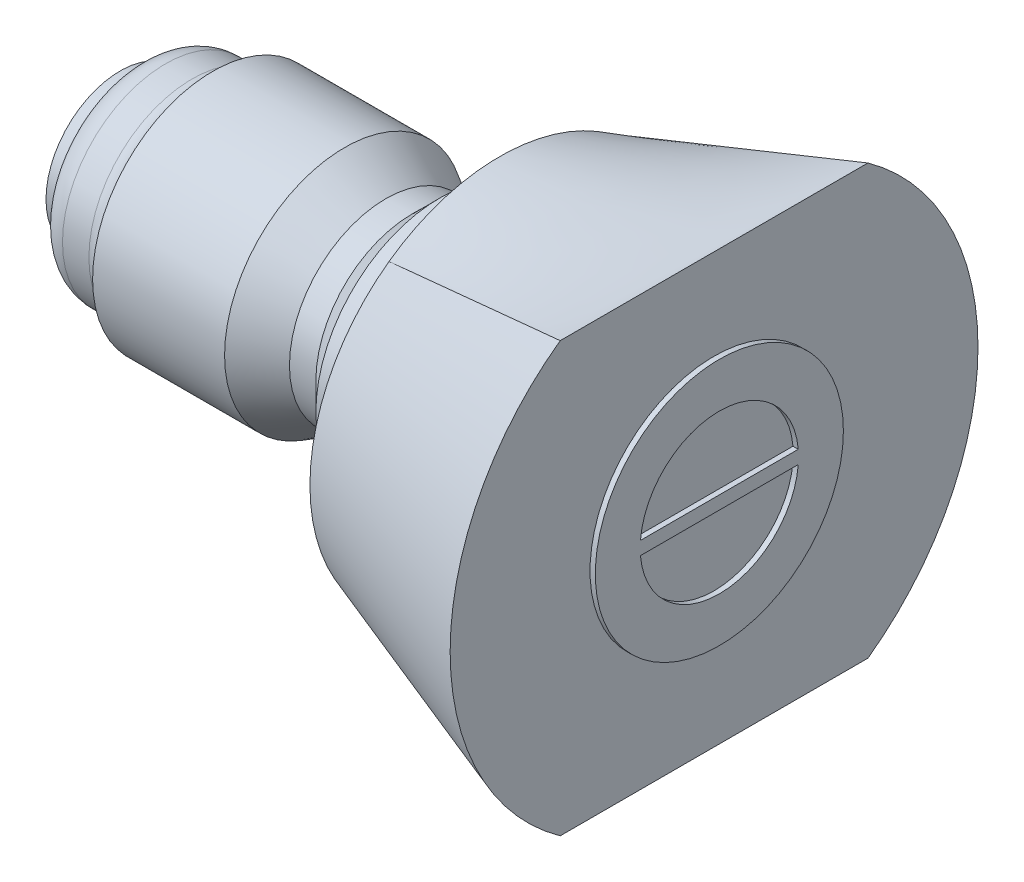
ISO-10303-21;
HEADER;
FILE_DESCRIPTION(('STEP AP214'),'2;1');
FILE_NAME('part.step','',(''),(''),'','','');
FILE_SCHEMA(('AUTOMOTIVE_DESIGN { 1 0 10303 214 1 1 1 1 }'));
ENDSEC;
DATA;
#1=APPLICATION_CONTEXT('core data for automotive mechanical design processes');
#2=APPLICATION_PROTOCOL_DEFINITION('international standard','automotive_design',2000,#1);
#3=PRODUCT_CONTEXT('',#1,'mechanical');
#4=PRODUCT('Part','Part','',(#3));
#5=PRODUCT_RELATED_PRODUCT_CATEGORY('part','',(#4));
#6=PRODUCT_DEFINITION_FORMATION('','',#4);
#7=PRODUCT_DEFINITION_CONTEXT('part definition',#1,'design');
#8=PRODUCT_DEFINITION('design','',#6,#7);
#9=PRODUCT_DEFINITION_SHAPE('','',#8);
#10=(LENGTH_UNIT() NAMED_UNIT(*) SI_UNIT(.MILLI.,.METRE.));
#11=(NAMED_UNIT(*) PLANE_ANGLE_UNIT() SI_UNIT($,.RADIAN.));
#12=(NAMED_UNIT(*) SI_UNIT($,.STERADIAN.) SOLID_ANGLE_UNIT());
#13=UNCERTAINTY_MEASURE_WITH_UNIT(LENGTH_MEASURE(1.E-05),#10,'distance_accuracy_value','');
#14=(GEOMETRIC_REPRESENTATION_CONTEXT(3) GLOBAL_UNCERTAINTY_ASSIGNED_CONTEXT((#13)) GLOBAL_UNIT_ASSIGNED_CONTEXT((#10,
#11,#12)) REPRESENTATION_CONTEXT('',''));
#15=CARTESIAN_POINT('',(0.,0.,0.));
#16=DIRECTION('',(0.,0.,1.));
#17=DIRECTION('',(1.,0.,0.));
#18=AXIS2_PLACEMENT_3D('',#15,#16,#17);
#19=CARTESIAN_POINT('',(0.,0.,0.));
#20=DIRECTION('',(-1.,0.,0.));
#21=DIRECTION('',(0.,0.,1.));
#22=AXIS2_PLACEMENT_3D('',#19,#20,#21);
#23=CYLINDRICAL_SURFACE('',#22,3.175);
#24=CARTESIAN_POINT('',(0.,0.,0.));
#25=DIRECTION('',(-1.,0.,0.));
#26=DIRECTION('',(0.,0.,1.));
#27=AXIS2_PLACEMENT_3D('',#24,#25,#26);
#28=CIRCLE('',#27,3.175);
#29=CARTESIAN_POINT('',(0.,0.,3.175));
#30=VERTEX_POINT('',#29);
#31=EDGE_CURVE('E287',#30,#30,#28,.T.);
#32=ORIENTED_EDGE('',*,*,#31,.T.);
#33=EDGE_LOOP('',(#32));
#34=FACE_BOUND('',#33,.T.);
#35=CARTESIAN_POINT('',(18.25625,0.,0.));
#36=DIRECTION('',(1.,0.,0.));
#37=DIRECTION('',(0.,0.,-1.));
#38=AXIS2_PLACEMENT_3D('',#35,#36,#37);
#39=CIRCLE('',#38,3.175);
#40=CARTESIAN_POINT('',(18.25625,0.,-3.175));
#41=VERTEX_POINT('',#40);
#42=EDGE_CURVE('E82',#41,#41,#39,.F.);
#43=ORIENTED_EDGE('',*,*,#42,.F.);
#44=EDGE_LOOP('',(#43));
#45=FACE_BOUND('',#44,.T.);
#46=ADVANCED_FACE('F71',(#34,#45),#23,.F.);
#47=CARTESIAN_POINT('',(0.,0.,0.));
#48=DIRECTION('',(-1.,0.,0.));
#49=DIRECTION('',(0.,0.,1.));
#50=AXIS2_PLACEMENT_3D('',#47,#48,#49);
#51=CYLINDRICAL_SURFACE('',#50,5.953125);
#52=CARTESIAN_POINT('',(15.3666044903084,0.,0.));
#53=DIRECTION('',(-1.,0.,0.));
#54=DIRECTION('',(0.,0.,1.));
#55=AXIS2_PLACEMENT_3D('',#52,#53,#54);
#56=CIRCLE('',#55,5.953125);
#57=CARTESIAN_POINT('',(15.3666044903084,0.,5.953125));
#58=VERTEX_POINT('',#57);
#59=EDGE_CURVE('E284',#58,#58,#56,.T.);
#60=ORIENTED_EDGE('',*,*,#59,.F.);
#61=EDGE_LOOP('',(#60));
#62=FACE_BOUND('',#61,.T.);
#63=CARTESIAN_POINT('',(18.25625,0.,0.));
#64=DIRECTION('',(1.,0.,0.));
#65=DIRECTION('',(0.,0.,-1.));
#66=AXIS2_PLACEMENT_3D('',#63,#64,#65);
#67=CIRCLE('',#66,5.953125);
#68=CARTESIAN_POINT('',(18.25625,0.,-5.953125));
#69=VERTEX_POINT('',#68);
#70=EDGE_CURVE('E259',#69,#69,#67,.T.);
#71=ORIENTED_EDGE('',*,*,#70,.F.);
#72=EDGE_LOOP('',(#71));
#73=FACE_BOUND('',#72,.T.);
#74=ADVANCED_FACE('F309',(#62,#73),#51,.T.);
#75=CARTESIAN_POINT('',(0.,0.,-3.571875));
#76=DIRECTION('',(1.,0.,0.));
#77=DIRECTION('',(0.,0.,-1.));
#78=AXIS2_PLACEMENT_3D('',#75,#76,#77);
#79=PLANE('',#78);
#80=ORIENTED_EDGE('',*,*,#31,.F.);
#81=EDGE_LOOP('',(#80));
#82=FACE_BOUND('',#81,.T.);
#83=CARTESIAN_POINT('',(0.,0.,0.));
#84=DIRECTION('',(-1.,0.,0.));
#85=DIRECTION('',(0.,0.,1.));
#86=AXIS2_PLACEMENT_3D('',#83,#84,#85);
#87=CIRCLE('',#86,3.571875);
#88=CARTESIAN_POINT('',(0.,0.,3.571875));
#89=VERTEX_POINT('',#88);
#90=EDGE_CURVE('E260',#89,#89,#87,.T.);
#91=ORIENTED_EDGE('',*,*,#90,.T.);
#92=EDGE_LOOP('',(#91));
#93=FACE_BOUND('',#92,.T.);
#94=ADVANCED_FACE('F73',(#82,#93),#79,.F.);
#95=CARTESIAN_POINT('',(15.3666044903084,0.,0.));
#96=DIRECTION('',(1.,0.,0.));
#97=DIRECTION('',(0.,0.,-1.));
#98=AXIS2_PLACEMENT_3D('',#95,#96,#97);
#99=CONICAL_SURFACE('',#98,5.953125,0.78539816339745);
#100=CARTESIAN_POINT('',(14.0489794903084,0.,0.));
#101=DIRECTION('',(-1.,0.,0.));
#102=DIRECTION('',(0.,0.,1.));
#103=AXIS2_PLACEMENT_3D('',#100,#101,#102);
#104=CIRCLE('',#103,4.6355);
#105=CARTESIAN_POINT('',(14.0489794903084,0.,4.6355));
#106=VERTEX_POINT('',#105);
#107=EDGE_CURVE('E281',#106,#106,#104,.T.);
#108=ORIENTED_EDGE('',*,*,#107,.F.);
#109=EDGE_LOOP('',(#108));
#110=FACE_BOUND('',#109,.T.);
#111=ORIENTED_EDGE('',*,*,#59,.T.);
#112=EDGE_LOOP('',(#111));
#113=FACE_BOUND('',#112,.T.);
#114=ADVANCED_FACE('F591',(#110,#113),#99,.T.);
#115=CARTESIAN_POINT('',(0.,0.,0.));
#116=DIRECTION('',(-1.,0.,0.));
#117=DIRECTION('',(0.,0.,1.));
#118=AXIS2_PLACEMENT_3D('',#115,#116,#117);
#119=CYLINDRICAL_SURFACE('',#118,4.6355);
#120=CARTESIAN_POINT('',(12.7789794903084,0.,0.));
#121=DIRECTION('',(-1.,0.,0.));
#122=DIRECTION('',(0.,0.,1.));
#123=AXIS2_PLACEMENT_3D('',#120,#121,#122);
#124=CIRCLE('',#123,4.6355);
#125=CARTESIAN_POINT('',(12.7789794903084,0.,4.6355));
#126=VERTEX_POINT('',#125);
#127=EDGE_CURVE('E278',#126,#126,#124,.T.);
#128=ORIENTED_EDGE('',*,*,#127,.F.);
#129=EDGE_LOOP('',(#128));
#130=FACE_BOUND('',#129,.T.);
#131=ORIENTED_EDGE('',*,*,#107,.T.);
#132=EDGE_LOOP('',(#131));
#133=FACE_BOUND('',#132,.T.);
#134=ADVANCED_FACE('F581',(#130,#133),#119,.T.);
#135=CARTESIAN_POINT('',(12.7789794903084,0.,0.));
#136=DIRECTION('',(-1.,0.,0.));
#137=DIRECTION('',(0.,0.,1.));
#138=AXIS2_PLACEMENT_3D('',#135,#136,#137);
#139=CONICAL_SURFACE('',#138,4.6355,0.5235987755983);
#140=CARTESIAN_POINT('',(10.7992454172572,0.,0.));
#141=DIRECTION('',(-1.,0.,0.));
#142=DIRECTION('',(0.,0.,1.));
#143=AXIS2_PLACEMENT_3D('',#140,#141,#142);
#144=CIRCLE('',#143,5.7785);
#145=CARTESIAN_POINT('',(10.7992454172572,0.,5.7785));
#146=VERTEX_POINT('',#145);
#147=EDGE_CURVE('E275',#146,#146,#144,.T.);
#148=ORIENTED_EDGE('',*,*,#147,.F.);
#149=EDGE_LOOP('',(#148));
#150=FACE_BOUND('',#149,.T.);
#151=ORIENTED_EDGE('',*,*,#127,.T.);
#152=EDGE_LOOP('',(#151));
#153=FACE_BOUND('',#152,.T.);
#154=ADVANCED_FACE('F571',(#150,#153),#139,.T.);
#155=CARTESIAN_POINT('',(0.,0.,0.));
#156=DIRECTION('',(-1.,0.,0.));
#157=DIRECTION('',(0.,0.,1.));
#158=AXIS2_PLACEMENT_3D('',#155,#156,#157);
#159=CYLINDRICAL_SURFACE('',#158,5.7785);
#160=CARTESIAN_POINT('',(4.44924541725723,0.,0.));
#161=DIRECTION('',(-1.,0.,0.));
#162=DIRECTION('',(0.,0.,1.));
#163=AXIS2_PLACEMENT_3D('',#160,#161,#162);
#164=CIRCLE('',#163,5.7785);
#165=CARTESIAN_POINT('',(4.44924541725723,0.,5.7785));
#166=VERTEX_POINT('',#165);
#167=EDGE_CURVE('E272',#166,#166,#164,.T.);
#168=ORIENTED_EDGE('',*,*,#167,.F.);
#169=EDGE_LOOP('',(#168));
#170=FACE_BOUND('',#169,.T.);
#171=ORIENTED_EDGE('',*,*,#147,.T.);
#172=EDGE_LOOP('',(#171));
#173=FACE_BOUND('',#172,.T.);
#174=ADVANCED_FACE('F561',(#170,#173),#159,.T.);
#175=CARTESIAN_POINT('',(3.4528125,0.,0.));
#176=DIRECTION('',(-1.,0.,0.));
#177=DIRECTION('',(0.,0.,1.));
#178=AXIS2_PLACEMENT_3D('',#175,#176,#177);
#179=TOROIDAL_SURFACE('',#178,5.9769375,1.016);
#180=CARTESIAN_POINT('',(3.4528125,0.,0.));
#181=DIRECTION('',(-1.,0.,0.));
#182=DIRECTION('',(0.,0.,1.));
#183=AXIS2_PLACEMENT_3D('',#180,#181,#182);
#184=CIRCLE('',#183,4.9609375);
#185=CARTESIAN_POINT('',(3.4528125,0.,4.9609375));
#186=VERTEX_POINT('',#185);
#187=EDGE_CURVE('E269',#186,#186,#184,.T.);
#188=ORIENTED_EDGE('',*,*,#187,.F.);
#189=EDGE_LOOP('',(#188));
#190=FACE_BOUND('',#189,.T.);
#191=ORIENTED_EDGE('',*,*,#167,.T.);
#192=EDGE_LOOP('',(#191));
#193=FACE_BOUND('',#192,.T.);
#194=ADVANCED_FACE('F551',(#190,#193),#179,.F.);
#195=CARTESIAN_POINT('',(0.,0.,0.));
#196=DIRECTION('',(-1.,0.,0.));
#197=DIRECTION('',(0.,0.,1.));
#198=AXIS2_PLACEMENT_3D('',#195,#196,#197);
#199=CYLINDRICAL_SURFACE('',#198,4.9609375);
#200=CARTESIAN_POINT('',(2.1828125,0.,0.));
#201=DIRECTION('',(-1.,0.,0.));
#202=DIRECTION('',(0.,0.,1.));
#203=AXIS2_PLACEMENT_3D('',#200,#201,#202);
#204=CIRCLE('',#203,4.9609375);
#205=CARTESIAN_POINT('',(2.1828125,0.,4.9609375));
#206=VERTEX_POINT('',#205);
#207=EDGE_CURVE('E266',#206,#206,#204,.T.);
#208=ORIENTED_EDGE('',*,*,#207,.F.);
#209=EDGE_LOOP('',(#208));
#210=FACE_BOUND('',#209,.T.);
#211=ORIENTED_EDGE('',*,*,#187,.T.);
#212=EDGE_LOOP('',(#211));
#213=FACE_BOUND('',#212,.T.);
#214=ADVANCED_FACE('F541',(#210,#213),#199,.T.);
#215=CARTESIAN_POINT('',(2.1828125,0.,0.));
#216=DIRECTION('',(-1.,0.,0.));
#217=DIRECTION('',(0.,0.,1.));
#218=AXIS2_PLACEMENT_3D('',#215,#216,#217);
#219=TOROIDAL_SURFACE('',#218,3.571875,1.3890625);
#220=CARTESIAN_POINT('',(0.79375,0.,0.));
#221=DIRECTION('',(-1.,0.,0.));
#222=DIRECTION('',(0.,0.,1.));
#223=AXIS2_PLACEMENT_3D('',#220,#221,#222);
#224=CIRCLE('',#223,3.571875);
#225=CARTESIAN_POINT('',(0.79375,0.,3.571875));
#226=VERTEX_POINT('',#225);
#227=EDGE_CURVE('E263',#226,#226,#224,.T.);
#228=ORIENTED_EDGE('',*,*,#227,.F.);
#229=EDGE_LOOP('',(#228));
#230=FACE_BOUND('',#229,.T.);
#231=ORIENTED_EDGE('',*,*,#207,.T.);
#232=EDGE_LOOP('',(#231));
#233=FACE_BOUND('',#232,.T.);
#234=ADVANCED_FACE('F442',(#230,#233),#219,.T.);
#235=CARTESIAN_POINT('',(0.,0.,0.));
#236=DIRECTION('',(-1.,0.,0.));
#237=DIRECTION('',(0.,0.,1.));
#238=AXIS2_PLACEMENT_3D('',#235,#236,#237);
#239=CYLINDRICAL_SURFACE('',#238,3.571875);
#240=ORIENTED_EDGE('',*,*,#90,.F.);
#241=EDGE_LOOP('',(#240));
#242=FACE_BOUND('',#241,.T.);
#243=ORIENTED_EDGE('',*,*,#227,.T.);
#244=EDGE_LOOP('',(#243));
#245=FACE_BOUND('',#244,.T.);
#246=ADVANCED_FACE('F437',(#242,#245),#239,.T.);
#247=CARTESIAN_POINT('',(18.25625,0.,0.));
#248=DIRECTION('',(1.,0.,0.));
#249=DIRECTION('',(0.,0.,-1.));
#250=AXIS2_PLACEMENT_3D('',#247,#248,#249);
#251=CONICAL_SURFACE('',#250,9.128125,0.333244301111673);
#252=DIRECTION('',(0.944986073440258,0.265777333155073,-0.190692763850495));
#253=VECTOR('',#252,1.);
#254=CARTESIAN_POINT('',(18.25625,7.4166015625,-5.32134261993602));
#255=LINE('',#254,#253);
#256=CARTESIAN_POINT('',(18.25625,7.4166015625,-5.32134261993602));
#257=VERTEX_POINT('',#256);
#258=CARTESIAN_POINT('',(28.575,10.31875,-7.40360712338926));
#259=VERTEX_POINT('',#258);
#260=EDGE_CURVE('E340',#257,#259,#255,.T.);
#261=ORIENTED_EDGE('',*,*,#260,.T.);
#262=CARTESIAN_POINT('',(28.575,0.,0.));
#263=DIRECTION('',(1.,0.,0.));
#264=DIRECTION('',(0.,0.,-1.));
#265=AXIS2_PLACEMENT_3D('',#262,#263,#264);
#266=CIRCLE('',#265,12.7);
#267=CARTESIAN_POINT('',(28.575,-10.31875,-7.40360712338924));
#268=VERTEX_POINT('',#267);
#269=EDGE_CURVE('E245',#268,#259,#266,.T.);
#270=ORIENTED_EDGE('',*,*,#269,.F.);
#271=DIRECTION('',(0.944986073440258,-0.265777333155072,-0.190692763850494));
#272=VECTOR('',#271,1.);
#273=CARTESIAN_POINT('',(23.415625,-8.86767578125,-6.36247487166263));
#274=LINE('',#273,#272);
#275=CARTESIAN_POINT('',(18.25625,-7.4166015625,-5.32134261993602));
#276=VERTEX_POINT('',#275);
#277=EDGE_CURVE('E334',#276,#268,#274,.T.);
#278=ORIENTED_EDGE('',*,*,#277,.F.);
#279=CARTESIAN_POINT('',(18.25625,0.,0.));
#280=DIRECTION('',(1.,0.,0.));
#281=DIRECTION('',(0.,0.,-1.));
#282=AXIS2_PLACEMENT_3D('',#279,#280,#281);
#283=CIRCLE('',#282,9.128125);
#284=EDGE_CURVE('E185',#276,#257,#283,.T.);
#285=ORIENTED_EDGE('',*,*,#284,.T.);
#286=EDGE_LOOP('',(#261,#270,#278,#285));
#287=FACE_BOUND('',#286,.T.);
#288=ADVANCED_FACE('F374',(#287),#251,.T.);
#289=CARTESIAN_POINT('',(18.25625,-7.4166015625,5.32134261993603));
#290=CARTESIAN_POINT('',(28.575,-10.31875,7.40360712338925));
#291=CARTESIAN_POINT('',(18.25625,-7.93362426757812,4.60074414015302));
#292=CARTESIAN_POINT('',(28.575,-10.31875,6.16967260282437));
#293=CARTESIAN_POINT('',(18.25625,-8.36879082515359,3.76776560053847));
#294=CARTESIAN_POINT('',(28.575,-10.31875,4.93573808225949));
#295=CARTESIAN_POINT('',(18.25625,-8.9669759815691,1.95603150325827));
#296=CARTESIAN_POINT('',(28.575,-10.31875,2.46786904112973));
#297=CARTESIAN_POINT('',(18.25625,-9.128125,0.978637723206629));
#298=CARTESIAN_POINT('',(28.575,-10.31875,1.23393452056486));
#299=CARTESIAN_POINT('',(18.25625,-9.128125,-0.978637723206618));
#300=CARTESIAN_POINT('',(28.575,-10.31875,-1.23393452056489));
#301=CARTESIAN_POINT('',(18.25625,-8.9669759815691,-1.95603150325826));
#302=CARTESIAN_POINT('',(28.575,-10.31875,-2.46786904112976));
#303=CARTESIAN_POINT('',(18.25625,-8.36879082515359,-3.76776560053846));
#304=CARTESIAN_POINT('',(28.575,-10.31875,-4.9357380822595));
#305=CARTESIAN_POINT('',(18.25625,-7.93362426757813,-4.60074414015301));
#306=CARTESIAN_POINT('',(28.575,-10.31875,-6.16967260282437));
#307=CARTESIAN_POINT('',(18.25625,-7.4166015625,-5.32134261993602));
#308=CARTESIAN_POINT('',(28.575,-10.31875,-7.40360712338924));
#309=B_SPLINE_SURFACE_WITH_KNOTS('',3,1,((#289,#290),(#291,#292),(#293,#294),(#295,#296),(#297,
#298),(#299,#300),(#301,#302),(#303,#304),(#305,#306),(#307,#308)),.UNSPECIFIED.,.F.,.F.,.F.,(4,
2,2,2,4),(2,2),(0.,0.25,0.5,0.75,1.),(0.,1.),.UNSPECIFIED.);
#310=CARTESIAN_POINT('',(18.25625,-7.4166015625,5.32134261993602));
#311=VERTEX_POINT('',#310);
#312=EDGE_CURVE('E176',#311,#276,#283,.T.);
#313=DIRECTION('',(0.,0.,-1.));
#314=VECTOR('',#313,1.);
#315=CARTESIAN_POINT('',(28.575,-10.31875,7.40360712338925));
#316=LINE('',#315,#314);
#317=CARTESIAN_POINT('',(28.575,-10.31875,7.40360712338925));
#318=VERTEX_POINT('',#317);
#319=EDGE_CURVE('E250',#318,#268,#316,.T.);
#320=DIRECTION('',(0.944986073440258,-0.265777333155073,0.190692763850495));
#321=VECTOR('',#320,1.);
#322=CARTESIAN_POINT('',(18.25625,-7.4166015625,5.32134261993602));
#323=LINE('',#322,#321);
#324=EDGE_CURVE('E335',#311,#318,#323,.T.);
#325=ORIENTED_EDGE('',*,*,#312,.T.);
#326=ORIENTED_EDGE('',*,*,#277,.T.);
#327=ORIENTED_EDGE('',*,*,#319,.F.);
#328=ORIENTED_EDGE('',*,*,#324,.F.);
#329=EDGE_LOOP('',(#325,#326,#327,#328));
#330=FACE_BOUND('',#329,.T.);
#331=ADVANCED_FACE('F363',(#330),#309,.T.);
#332=CARTESIAN_POINT('',(18.25625,7.4166015625,-5.32134261993603));
#333=CARTESIAN_POINT('',(28.575,10.31875,-7.40360712338926));
#334=CARTESIAN_POINT('',(18.25625,7.93362426757812,-4.60074414015302));
#335=CARTESIAN_POINT('',(28.575,10.31875,-6.16967260282438));
#336=CARTESIAN_POINT('',(18.25625,8.36879082515359,-3.76776560053847));
#337=CARTESIAN_POINT('',(28.575,10.31875,-4.93573808225951));
#338=CARTESIAN_POINT('',(18.25625,8.9669759815691,-1.95603150325827));
#339=CARTESIAN_POINT('',(28.575,10.31875,-2.46786904112975));
#340=CARTESIAN_POINT('',(18.25625,9.128125,-0.978637723206628));
#341=CARTESIAN_POINT('',(28.575,10.31875,-1.23393452056488));
#342=CARTESIAN_POINT('',(18.25625,9.128125,0.97863772320662));
#343=CARTESIAN_POINT('',(28.575,10.31875,1.23393452056487));
#344=CARTESIAN_POINT('',(18.25625,8.9669759815691,1.95603150325826));
#345=CARTESIAN_POINT('',(28.575,10.31875,2.46786904112975));
#346=CARTESIAN_POINT('',(18.25625,8.36879082515359,3.76776560053846));
#347=CARTESIAN_POINT('',(28.575,10.31875,4.9357380822595));
#348=CARTESIAN_POINT('',(18.25625,7.93362426757813,4.60074414015302));
#349=CARTESIAN_POINT('',(28.575,10.31875,6.16967260282437));
#350=CARTESIAN_POINT('',(18.25625,7.4166015625,5.32134261993602));
#351=CARTESIAN_POINT('',(28.575,10.31875,7.40360712338925));
#352=B_SPLINE_SURFACE_WITH_KNOTS('',3,1,((#332,#333),(#334,#335),(#336,#337),(#338,#339),(#340,
#341),(#342,#343),(#344,#345),(#346,#347),(#348,#349),(#350,#351)),.UNSPECIFIED.,.F.,.F.,.F.,(4,
2,2,2,4),(2,2),(0.,0.25,0.5,0.75,1.),(0.,1.),.UNSPECIFIED.);
#353=CARTESIAN_POINT('',(18.25625,7.4166015625,5.32134261993602));
#354=VERTEX_POINT('',#353);
#355=EDGE_CURVE('E192',#257,#354,#283,.T.);
#356=DIRECTION('',(0.944986073440258,0.265777333155072,0.190692763850495));
#357=VECTOR('',#356,1.);
#358=CARTESIAN_POINT('',(18.25625,7.4166015625,5.32134261993602));
#359=LINE('',#358,#357);
#360=CARTESIAN_POINT('',(28.575,10.31875,7.40360712338925));
#361=VERTEX_POINT('',#360);
#362=EDGE_CURVE('E330',#354,#361,#359,.T.);
#363=DIRECTION('',(0.,0.,-1.));
#364=VECTOR('',#363,1.);
#365=CARTESIAN_POINT('',(28.575,10.31875,7.40360712338925));
#366=LINE('',#365,#364);
#367=EDGE_CURVE('E249',#361,#259,#366,.T.);
#368=ORIENTED_EDGE('',*,*,#355,.T.);
#369=ORIENTED_EDGE('',*,*,#362,.T.);
#370=ORIENTED_EDGE('',*,*,#367,.T.);
#371=ORIENTED_EDGE('',*,*,#260,.F.);
#372=EDGE_LOOP('',(#368,#369,#370,#371));
#373=FACE_BOUND('',#372,.T.);
#374=ADVANCED_FACE('F331',(#373),#352,.T.);
#375=CARTESIAN_POINT('',(18.25625,0.,0.));
#376=DIRECTION('',(1.,0.,0.));
#377=DIRECTION('',(0.,0.,-1.));
#378=AXIS2_PLACEMENT_3D('',#375,#376,#377);
#379=CONICAL_SURFACE('',#378,9.128125,0.333244301111673);
#380=ORIENTED_EDGE('',*,*,#324,.T.);
#381=CARTESIAN_POINT('',(28.575,0.,0.));
#382=DIRECTION('',(1.,0.,0.));
#383=DIRECTION('',(0.,0.,-1.));
#384=AXIS2_PLACEMENT_3D('',#381,#382,#383);
#385=CIRCLE('',#384,12.7);
#386=EDGE_CURVE('E256',#361,#318,#385,.T.);
#387=ORIENTED_EDGE('',*,*,#386,.F.);
#388=ORIENTED_EDGE('',*,*,#362,.F.);
#389=EDGE_CURVE('E195',#354,#311,#283,.T.);
#390=ORIENTED_EDGE('',*,*,#389,.T.);
#391=EDGE_LOOP('',(#380,#387,#388,#390));
#392=FACE_BOUND('',#391,.T.);
#393=ADVANCED_FACE('F218',(#392),#379,.T.);
#394=CARTESIAN_POINT('',(18.25625,0.,0.));
#395=DIRECTION('',(1.,0.,0.));
#396=DIRECTION('',(0.,0.,-1.));
#397=AXIS2_PLACEMENT_3D('',#394,#395,#396);
#398=PLANE('',#397);
#399=ORIENTED_EDGE('',*,*,#70,.T.);
#400=EDGE_LOOP('',(#399));
#401=FACE_BOUND('',#400,.T.);
#402=ORIENTED_EDGE('',*,*,#284,.F.);
#403=ORIENTED_EDGE('',*,*,#312,.F.);
#404=ORIENTED_EDGE('',*,*,#389,.F.);
#405=ORIENTED_EDGE('',*,*,#355,.F.);
#406=EDGE_LOOP('',(#402,#403,#404,#405));
#407=FACE_BOUND('',#406,.T.);
#408=ADVANCED_FACE('F207',(#401,#407),#398,.F.);
#409=CARTESIAN_POINT('',(28.575,0.,-5.953125));
#410=DIRECTION('',(-1.,0.,0.));
#411=DIRECTION('',(0.,0.,1.));
#412=AXIS2_PLACEMENT_3D('',#409,#410,#411);
#413=PLANE('',#412);
#414=CARTESIAN_POINT('',(28.575,0.,0.));
#415=DIRECTION('',(1.,0.,0.));
#416=DIRECTION('',(0.,0.,-1.));
#417=AXIS2_PLACEMENT_3D('',#414,#415,#416);
#418=CIRCLE('',#417,5.969);
#419=CARTESIAN_POINT('',(28.575,0.,-5.969));
#420=VERTEX_POINT('',#419);
#421=EDGE_CURVE('E12',#420,#420,#418,.T.);
#422=ORIENTED_EDGE('',*,*,#421,.F.);
#423=EDGE_LOOP('',(#422));
#424=FACE_BOUND('',#423,.T.);
#425=ORIENTED_EDGE('',*,*,#386,.T.);
#426=ORIENTED_EDGE('',*,*,#319,.T.);
#427=ORIENTED_EDGE('',*,*,#269,.T.);
#428=ORIENTED_EDGE('',*,*,#367,.F.);
#429=EDGE_LOOP('',(#425,#426,#427,#428));
#430=FACE_BOUND('',#429,.T.);
#431=ADVANCED_FACE('F217',(#424,#430),#413,.F.);
#432=ORIENTED_EDGE('',*,*,#42,.T.);
#433=EDGE_LOOP('',(#432));
#434=FACE_BOUND('',#433,.T.);
#435=ADVANCED_FACE('F220',(#434),#398,.F.);
#436=CARTESIAN_POINT('',(28.829,0.,0.));
#437=DIRECTION('',(-1.,0.,0.));
#438=DIRECTION('',(0.,0.,1.));
#439=AXIS2_PLACEMENT_3D('',#436,#437,#438);
#440=CYLINDRICAL_SURFACE('',#439,5.969);
#441=CARTESIAN_POINT('',(28.829,0.,0.));
#442=DIRECTION('',(1.,0.,0.));
#443=DIRECTION('',(0.,0.,-1.));
#444=AXIS2_PLACEMENT_3D('',#441,#442,#443);
#445=CIRCLE('',#444,5.969);
#446=CARTESIAN_POINT('',(28.829,0.,-5.969));
#447=VERTEX_POINT('',#446);
#448=EDGE_CURVE('E159',#447,#447,#445,.T.);
#449=ORIENTED_EDGE('',*,*,#448,.F.);
#450=EDGE_LOOP('',(#449));
#451=FACE_BOUND('',#450,.T.);
#452=ORIENTED_EDGE('',*,*,#421,.T.);
#453=EDGE_LOOP('',(#452));
#454=FACE_BOUND('',#453,.T.);
#455=ADVANCED_FACE('F221',(#451,#454),#440,.T.);
#456=CARTESIAN_POINT('',(28.829,0.,0.));
#457=DIRECTION('',(1.,0.,0.));
#458=DIRECTION('',(0.,0.,-1.));
#459=AXIS2_PLACEMENT_3D('',#456,#457,#458);
#460=PLANE('',#459);
#461=CARTESIAN_POINT('',(28.829,0.,0.));
#462=DIRECTION('',(1.,0.,0.));
#463=DIRECTION('',(0.,0.,-1.));
#464=AXIS2_PLACEMENT_3D('',#461,#462,#463);
#465=CIRCLE('',#464,3.81);
#466=CARTESIAN_POINT('',(28.829,0.317499999999999,-3.79674778593469));
#467=VERTEX_POINT('',#466);
#468=CARTESIAN_POINT('',(28.829,0.3175,3.79674778593469));
#469=VERTEX_POINT('',#468);
#470=EDGE_CURVE('E90',#467,#469,#465,.T.);
#471=ORIENTED_EDGE('',*,*,#470,.F.);
#472=DIRECTION('',(0.,0.,-1.));
#473=VECTOR('',#472,1.);
#474=CARTESIAN_POINT('',(28.829,0.3175,3.79674778593469));
#475=LINE('',#474,#473);
#476=EDGE_CURVE('E152',#469,#467,#475,.T.);
#477=ORIENTED_EDGE('',*,*,#476,.F.);
#478=EDGE_LOOP('',(#471,#477));
#479=FACE_BOUND('',#478,.T.);
#480=CARTESIAN_POINT('',(28.829,0.,0.));
#481=DIRECTION('',(1.,0.,0.));
#482=DIRECTION('',(0.,0.,-1.));
#483=AXIS2_PLACEMENT_3D('',#480,#481,#482);
#484=CIRCLE('',#483,3.81);
#485=CARTESIAN_POINT('',(28.829,-0.3175,3.79674778593469));
#486=VERTEX_POINT('',#485);
#487=CARTESIAN_POINT('',(28.829,-0.317499999999997,-3.79674778593469));
#488=VERTEX_POINT('',#487);
#489=EDGE_CURVE('E98',#486,#488,#484,.T.);
#490=ORIENTED_EDGE('',*,*,#489,.F.);
#491=DIRECTION('',(0.,0.,1.));
#492=VECTOR('',#491,1.);
#493=CARTESIAN_POINT('',(28.829,-0.3175,3.79674778593469));
#494=LINE('',#493,#492);
#495=EDGE_CURVE('E166',#488,#486,#494,.T.);
#496=ORIENTED_EDGE('',*,*,#495,.F.);
#497=EDGE_LOOP('',(#490,#496));
#498=FACE_BOUND('',#497,.T.);
#499=ORIENTED_EDGE('',*,*,#448,.T.);
#500=EDGE_LOOP('',(#499));
#501=FACE_BOUND('',#500,.T.);
#502=ADVANCED_FACE('F459',(#479,#498,#501),#460,.T.);
#503=CARTESIAN_POINT('',(28.575,0.,0.));
#504=DIRECTION('',(1.,0.,0.));
#505=DIRECTION('',(0.,0.,-1.));
#506=AXIS2_PLACEMENT_3D('',#503,#504,#505);
#507=CYLINDRICAL_SURFACE('',#506,3.81);
#508=ORIENTED_EDGE('',*,*,#489,.T.);
#509=DIRECTION('',(1.,0.,0.));
#510=VECTOR('',#509,1.);
#511=CARTESIAN_POINT('',(28.575,-0.317499999999997,-3.79674778593469));
#512=LINE('',#511,#510);
#513=CARTESIAN_POINT('',(28.575,-0.317499999999997,-3.79674778593469));
#514=VERTEX_POINT('',#513);
#515=EDGE_CURVE('E161',#514,#488,#512,.T.);
#516=ORIENTED_EDGE('',*,*,#515,.F.);
#517=CARTESIAN_POINT('',(28.575,0.,0.));
#518=DIRECTION('',(1.,0.,0.));
#519=DIRECTION('',(0.,0.,-1.));
#520=AXIS2_PLACEMENT_3D('',#517,#518,#519);
#521=CIRCLE('',#520,3.81);
#522=CARTESIAN_POINT('',(28.575,-0.3175,3.79674778593469));
#523=VERTEX_POINT('',#522);
#524=EDGE_CURVE('E169',#523,#514,#521,.T.);
#525=ORIENTED_EDGE('',*,*,#524,.F.);
#526=DIRECTION('',(1.,0.,0.));
#527=VECTOR('',#526,1.);
#528=CARTESIAN_POINT('',(28.575,-0.3175,3.79674778593469));
#529=LINE('',#528,#527);
#530=EDGE_CURVE('E164',#523,#486,#529,.T.);
#531=ORIENTED_EDGE('',*,*,#530,.T.);
#532=EDGE_LOOP('',(#508,#516,#525,#531));
#533=FACE_BOUND('',#532,.T.);
#534=ADVANCED_FACE('F464',(#533),#507,.F.);
#535=CARTESIAN_POINT('',(28.575,-0.3175,3.79674778593469));
#536=DIRECTION('',(0.,1.,0.));
#537=DIRECTION('',(0.,0.,1.));
#538=AXIS2_PLACEMENT_3D('',#535,#536,#537);
#539=PLANE('',#538);
#540=ORIENTED_EDGE('',*,*,#495,.T.);
#541=ORIENTED_EDGE('',*,*,#530,.F.);
#542=DIRECTION('',(0.,0.,1.));
#543=VECTOR('',#542,1.);
#544=CARTESIAN_POINT('',(28.575,-0.3175,3.79674778593469));
#545=LINE('',#544,#543);
#546=EDGE_CURVE('E163',#514,#523,#545,.T.);
#547=ORIENTED_EDGE('',*,*,#546,.F.);
#548=ORIENTED_EDGE('',*,*,#515,.T.);
#549=EDGE_LOOP('',(#540,#541,#547,#548));
#550=FACE_BOUND('',#549,.T.);
#551=ADVANCED_FACE('F473',(#550),#539,.F.);
#552=CARTESIAN_POINT('',(28.575,0.,0.));
#553=DIRECTION('',(1.,0.,0.));
#554=DIRECTION('',(0.,0.,-1.));
#555=AXIS2_PLACEMENT_3D('',#552,#553,#554);
#556=PLANE('',#555);
#557=ORIENTED_EDGE('',*,*,#524,.T.);
#558=ORIENTED_EDGE('',*,*,#546,.T.);
#559=EDGE_LOOP('',(#557,#558));
#560=FACE_BOUND('',#559,.T.);
#561=ADVANCED_FACE('F477',(#560),#556,.T.);
#562=CARTESIAN_POINT('',(28.575,0.,0.));
#563=DIRECTION('',(1.,0.,0.));
#564=DIRECTION('',(0.,0.,-1.));
#565=AXIS2_PLACEMENT_3D('',#562,#563,#564);
#566=CYLINDRICAL_SURFACE('',#565,3.81);
#567=ORIENTED_EDGE('',*,*,#470,.T.);
#568=DIRECTION('',(1.,0.,0.));
#569=VECTOR('',#568,1.);
#570=CARTESIAN_POINT('',(28.575,0.3175,3.79674778593469));
#571=LINE('',#570,#569);
#572=CARTESIAN_POINT('',(28.575,0.3175,3.79674778593469));
#573=VERTEX_POINT('',#572);
#574=EDGE_CURVE('E138',#573,#469,#571,.T.);
#575=ORIENTED_EDGE('',*,*,#574,.F.);
#576=CARTESIAN_POINT('',(28.575,0.,0.));
#577=DIRECTION('',(1.,0.,0.));
#578=DIRECTION('',(0.,0.,-1.));
#579=AXIS2_PLACEMENT_3D('',#576,#577,#578);
#580=CIRCLE('',#579,3.81);
#581=CARTESIAN_POINT('',(28.575,0.317499999999999,-3.79674778593469));
#582=VERTEX_POINT('',#581);
#583=EDGE_CURVE('E141',#582,#573,#580,.T.);
#584=ORIENTED_EDGE('',*,*,#583,.F.);
#585=DIRECTION('',(1.,0.,0.));
#586=VECTOR('',#585,1.);
#587=CARTESIAN_POINT('',(28.575,0.317499999999999,-3.79674778593469));
#588=LINE('',#587,#586);
#589=EDGE_CURVE('E147',#582,#467,#588,.T.);
#590=ORIENTED_EDGE('',*,*,#589,.T.);
#591=EDGE_LOOP('',(#567,#575,#584,#590));
#592=FACE_BOUND('',#591,.T.);
#593=ADVANCED_FACE('F140',(#592),#566,.F.);
#594=CARTESIAN_POINT('',(28.575,0.3175,3.79674778593469));
#595=DIRECTION('',(0.,-1.,0.));
#596=DIRECTION('',(0.,0.,-1.));
#597=AXIS2_PLACEMENT_3D('',#594,#595,#596);
#598=PLANE('',#597);
#599=ORIENTED_EDGE('',*,*,#476,.T.);
#600=ORIENTED_EDGE('',*,*,#589,.F.);
#601=DIRECTION('',(0.,0.,-1.));
#602=VECTOR('',#601,1.);
#603=CARTESIAN_POINT('',(28.575,0.3175,3.79674778593469));
#604=LINE('',#603,#602);
#605=EDGE_CURVE('E148',#573,#582,#604,.T.);
#606=ORIENTED_EDGE('',*,*,#605,.F.);
#607=ORIENTED_EDGE('',*,*,#574,.T.);
#608=EDGE_LOOP('',(#599,#600,#606,#607));
#609=FACE_BOUND('',#608,.T.);
#610=ADVANCED_FACE('F154',(#609),#598,.F.);
#611=CARTESIAN_POINT('',(28.575,0.,0.));
#612=DIRECTION('',(1.,0.,0.));
#613=DIRECTION('',(0.,0.,-1.));
#614=AXIS2_PLACEMENT_3D('',#611,#612,#613);
#615=PLANE('',#614);
#616=ORIENTED_EDGE('',*,*,#583,.T.);
#617=ORIENTED_EDGE('',*,*,#605,.T.);
#618=EDGE_LOOP('',(#616,#617));
#619=FACE_BOUND('',#618,.T.);
#620=ADVANCED_FACE('F151',(#619),#615,.T.);
#621=CLOSED_SHELL('',(#46,#74,#94,#114,#134,#154,#174,#194,#214,#234,#246,#288,#331,#374,#393,
#408,#431,#435,#455,#502,#534,#551,#561,#593,#610,#620));
#622=MANIFOLD_SOLID_BREP('B2',#621);
#623=ADVANCED_BREP_SHAPE_REPRESENTATION('',(#18,#622),#14);
#624=SHAPE_DEFINITION_REPRESENTATION(#9,#623);
ENDSEC;
END-ISO-10303-21;
